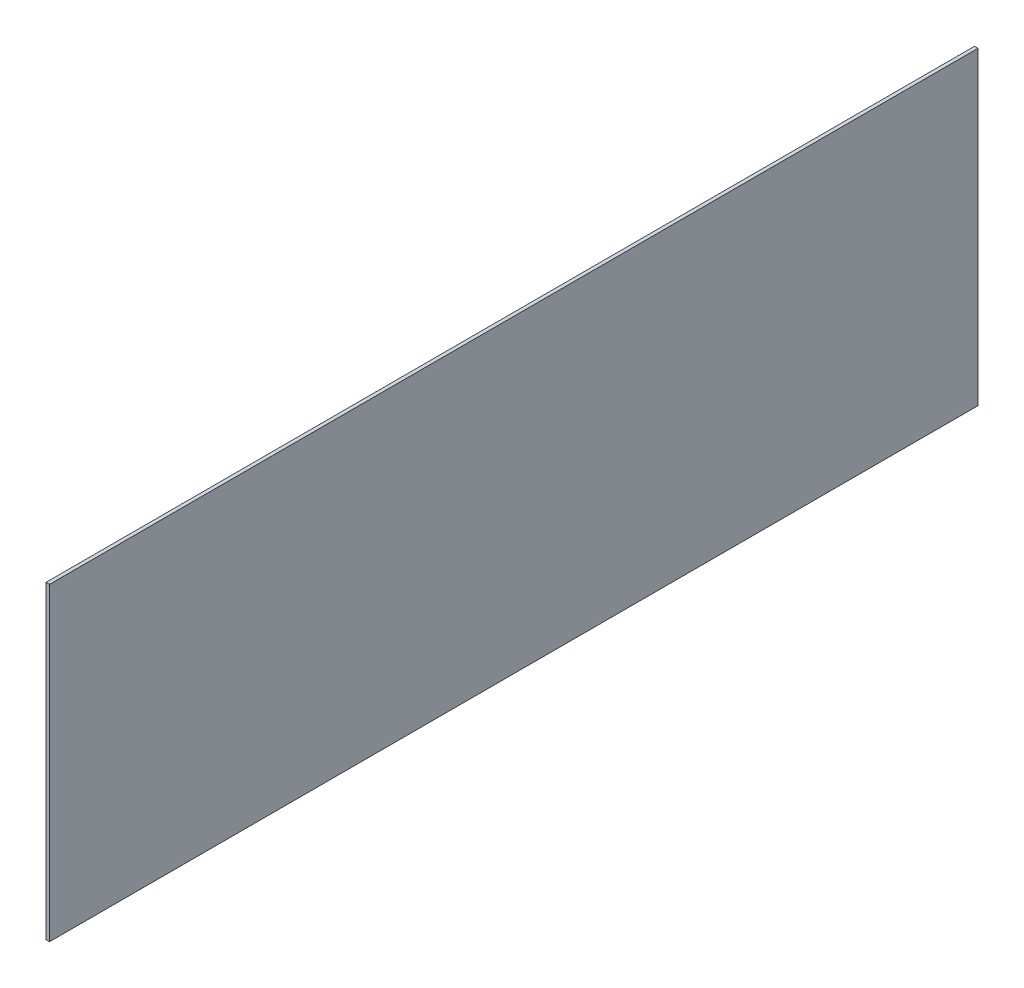
ISO-10303-21;
HEADER;
FILE_DESCRIPTION(('STEP AP214'),'2;1');
FILE_NAME('part.step','',(''),(''),'','','');
FILE_SCHEMA(('AUTOMOTIVE_DESIGN { 1 0 10303 214 1 1 1 1 }'));
ENDSEC;
DATA;
#1=APPLICATION_CONTEXT('core data for automotive mechanical design processes');
#2=APPLICATION_PROTOCOL_DEFINITION('international standard','automotive_design',2000,#1);
#3=PRODUCT_CONTEXT('',#1,'mechanical');
#4=PRODUCT('Part','Part','',(#3));
#5=PRODUCT_RELATED_PRODUCT_CATEGORY('part','',(#4));
#6=PRODUCT_DEFINITION_FORMATION('','',#4);
#7=PRODUCT_DEFINITION_CONTEXT('part definition',#1,'design');
#8=PRODUCT_DEFINITION('design','',#6,#7);
#9=PRODUCT_DEFINITION_SHAPE('','',#8);
#10=(LENGTH_UNIT() NAMED_UNIT(*) SI_UNIT(.MILLI.,.METRE.));
#11=(NAMED_UNIT(*) PLANE_ANGLE_UNIT() SI_UNIT($,.RADIAN.));
#12=(NAMED_UNIT(*) SI_UNIT($,.STERADIAN.) SOLID_ANGLE_UNIT());
#13=UNCERTAINTY_MEASURE_WITH_UNIT(LENGTH_MEASURE(1.E-05),#10,'distance_accuracy_value','');
#14=(GEOMETRIC_REPRESENTATION_CONTEXT(3) GLOBAL_UNCERTAINTY_ASSIGNED_CONTEXT((#13)) GLOBAL_UNIT_ASSIGNED_CONTEXT((#10,
#11,#12)) REPRESENTATION_CONTEXT('',''));
#15=CARTESIAN_POINT('',(0.,0.,0.));
#16=DIRECTION('',(0.,0.,1.));
#17=DIRECTION('',(1.,0.,0.));
#18=AXIS2_PLACEMENT_3D('',#15,#16,#17);
#19=CARTESIAN_POINT('',(1.5875,0.,0.));
#20=DIRECTION('',(0.,0.,-1.));
#21=DIRECTION('',(-1.,0.,0.));
#22=AXIS2_PLACEMENT_3D('',#19,#20,#21);
#23=PLANE('',#22);
#24=DIRECTION('',(0.,-1.,0.));
#25=VECTOR('',#24,1.);
#26=CARTESIAN_POINT('',(0.,0.,0.));
#27=LINE('',#26,#25);
#28=CARTESIAN_POINT('',(0.,139.7,0.));
#29=VERTEX_POINT('',#28);
#30=CARTESIAN_POINT('',(0.,0.,0.));
#31=VERTEX_POINT('',#30);
#32=EDGE_CURVE('E96',#29,#31,#27,.T.);
#33=ORIENTED_EDGE('',*,*,#32,.T.);
#34=DIRECTION('',(-1.,0.,0.));
#35=VECTOR('',#34,1.);
#36=CARTESIAN_POINT('',(1.5875,0.,0.));
#37=LINE('',#36,#35);
#38=CARTESIAN_POINT('',(1.5875,0.,0.));
#39=VERTEX_POINT('',#38);
#40=EDGE_CURVE('E11',#39,#31,#37,.T.);
#41=ORIENTED_EDGE('',*,*,#40,.F.);
#42=DIRECTION('',(0.,-1.,0.));
#43=VECTOR('',#42,1.);
#44=CARTESIAN_POINT('',(1.5875,0.,0.));
#45=LINE('',#44,#43);
#46=CARTESIAN_POINT('',(1.5875,139.7,0.));
#47=VERTEX_POINT('',#46);
#48=EDGE_CURVE('E84',#47,#39,#45,.T.);
#49=ORIENTED_EDGE('',*,*,#48,.F.);
#50=DIRECTION('',(-1.,0.,0.));
#51=VECTOR('',#50,1.);
#52=CARTESIAN_POINT('',(1.5875,139.7,0.));
#53=LINE('',#52,#51);
#54=EDGE_CURVE('E92',#47,#29,#53,.T.);
#55=ORIENTED_EDGE('',*,*,#54,.T.);
#56=EDGE_LOOP('',(#33,#41,#49,#55));
#57=FACE_BOUND('',#56,.T.);
#58=ADVANCED_FACE('F33',(#57),#23,.F.);
#59=CARTESIAN_POINT('',(1.5875,0.,0.));
#60=DIRECTION('',(0.,1.,0.));
#61=DIRECTION('',(0.,0.,1.));
#62=AXIS2_PLACEMENT_3D('',#59,#60,#61);
#63=PLANE('',#62);
#64=DIRECTION('',(0.,0.,-1.));
#65=VECTOR('',#64,1.);
#66=CARTESIAN_POINT('',(0.,0.,0.));
#67=LINE('',#66,#65);
#68=CARTESIAN_POINT('',(0.,0.,-419.1));
#69=VERTEX_POINT('',#68);
#70=EDGE_CURVE('E88',#31,#69,#67,.T.);
#71=ORIENTED_EDGE('',*,*,#70,.T.);
#72=DIRECTION('',(-1.,0.,0.));
#73=VECTOR('',#72,1.);
#74=CARTESIAN_POINT('',(1.5875,0.,-419.1));
#75=LINE('',#74,#73);
#76=CARTESIAN_POINT('',(1.5875,0.,-419.1));
#77=VERTEX_POINT('',#76);
#78=EDGE_CURVE('E41',#77,#69,#75,.T.);
#79=ORIENTED_EDGE('',*,*,#78,.F.);
#80=DIRECTION('',(0.,0.,-1.));
#81=VECTOR('',#80,1.);
#82=CARTESIAN_POINT('',(1.5875,0.,0.));
#83=LINE('',#82,#81);
#84=EDGE_CURVE('E79',#39,#77,#83,.T.);
#85=ORIENTED_EDGE('',*,*,#84,.F.);
#86=ORIENTED_EDGE('',*,*,#40,.T.);
#87=EDGE_LOOP('',(#71,#79,#85,#86));
#88=FACE_BOUND('',#87,.T.);
#89=ADVANCED_FACE('F87',(#88),#63,.F.);
#90=CARTESIAN_POINT('',(1.5875,0.,-419.1));
#91=DIRECTION('',(0.,0.,1.));
#92=DIRECTION('',(1.,0.,0.));
#93=AXIS2_PLACEMENT_3D('',#90,#91,#92);
#94=PLANE('',#93);
#95=DIRECTION('',(0.,1.,0.));
#96=VECTOR('',#95,1.);
#97=CARTESIAN_POINT('',(0.,0.,-419.1));
#98=LINE('',#97,#96);
#99=CARTESIAN_POINT('',(0.,139.7,-419.1));
#100=VERTEX_POINT('',#99);
#101=EDGE_CURVE('E66',#69,#100,#98,.T.);
#102=ORIENTED_EDGE('',*,*,#101,.T.);
#103=DIRECTION('',(-1.,0.,0.));
#104=VECTOR('',#103,1.);
#105=CARTESIAN_POINT('',(1.5875,139.7,-419.1));
#106=LINE('',#105,#104);
#107=CARTESIAN_POINT('',(1.5875,139.7,-419.1));
#108=VERTEX_POINT('',#107);
#109=EDGE_CURVE('E89',#108,#100,#106,.T.);
#110=ORIENTED_EDGE('',*,*,#109,.F.);
#111=DIRECTION('',(0.,1.,0.));
#112=VECTOR('',#111,1.);
#113=CARTESIAN_POINT('',(1.5875,0.,-419.1));
#114=LINE('',#113,#112);
#115=EDGE_CURVE('E82',#77,#108,#114,.T.);
#116=ORIENTED_EDGE('',*,*,#115,.F.);
#117=ORIENTED_EDGE('',*,*,#78,.T.);
#118=EDGE_LOOP('',(#102,#110,#116,#117));
#119=FACE_BOUND('',#118,.T.);
#120=ADVANCED_FACE('F90',(#119),#94,.F.);
#121=CARTESIAN_POINT('',(1.5875,139.7,0.));
#122=DIRECTION('',(0.,-1.,0.));
#123=DIRECTION('',(0.,0.,-1.));
#124=AXIS2_PLACEMENT_3D('',#121,#122,#123);
#125=PLANE('',#124);
#126=DIRECTION('',(0.,0.,1.));
#127=VECTOR('',#126,1.);
#128=CARTESIAN_POINT('',(0.,139.7,0.));
#129=LINE('',#128,#127);
#130=EDGE_CURVE('E72',#100,#29,#129,.T.);
#131=ORIENTED_EDGE('',*,*,#130,.T.);
#132=ORIENTED_EDGE('',*,*,#54,.F.);
#133=DIRECTION('',(0.,0.,1.));
#134=VECTOR('',#133,1.);
#135=CARTESIAN_POINT('',(1.5875,139.7,0.));
#136=LINE('',#135,#134);
#137=EDGE_CURVE('E49',#108,#47,#136,.T.);
#138=ORIENTED_EDGE('',*,*,#137,.F.);
#139=ORIENTED_EDGE('',*,*,#109,.T.);
#140=EDGE_LOOP('',(#131,#132,#138,#139));
#141=FACE_BOUND('',#140,.T.);
#142=ADVANCED_FACE('F103',(#141),#125,.F.);
#143=CARTESIAN_POINT('',(1.5875,0.,0.));
#144=DIRECTION('',(-1.,0.,0.));
#145=DIRECTION('',(0.,0.,1.));
#146=AXIS2_PLACEMENT_3D('',#143,#144,#145);
#147=PLANE('',#146);
#148=ORIENTED_EDGE('',*,*,#48,.T.);
#149=ORIENTED_EDGE('',*,*,#84,.T.);
#150=ORIENTED_EDGE('',*,*,#115,.T.);
#151=ORIENTED_EDGE('',*,*,#137,.T.);
#152=EDGE_LOOP('',(#148,#149,#150,#151));
#153=FACE_BOUND('',#152,.T.);
#154=ADVANCED_FACE('F80',(#153),#147,.F.);
#155=CARTESIAN_POINT('',(0.,0.,0.));
#156=DIRECTION('',(-1.,0.,0.));
#157=DIRECTION('',(0.,0.,1.));
#158=AXIS2_PLACEMENT_3D('',#155,#156,#157);
#159=PLANE('',#158);
#160=ORIENTED_EDGE('',*,*,#32,.F.);
#161=ORIENTED_EDGE('',*,*,#130,.F.);
#162=ORIENTED_EDGE('',*,*,#101,.F.);
#163=ORIENTED_EDGE('',*,*,#70,.F.);
#164=EDGE_LOOP('',(#160,#161,#162,#163));
#165=FACE_BOUND('',#164,.T.);
#166=ADVANCED_FACE('F106',(#165),#159,.T.);
#167=CLOSED_SHELL('',(#58,#89,#120,#142,#154,#166));
#168=MANIFOLD_SOLID_BREP('B2',#167);
#169=ADVANCED_BREP_SHAPE_REPRESENTATION('',(#18,#168),#14);
#170=SHAPE_DEFINITION_REPRESENTATION(#9,#169);
ENDSEC;
END-ISO-10303-21;
